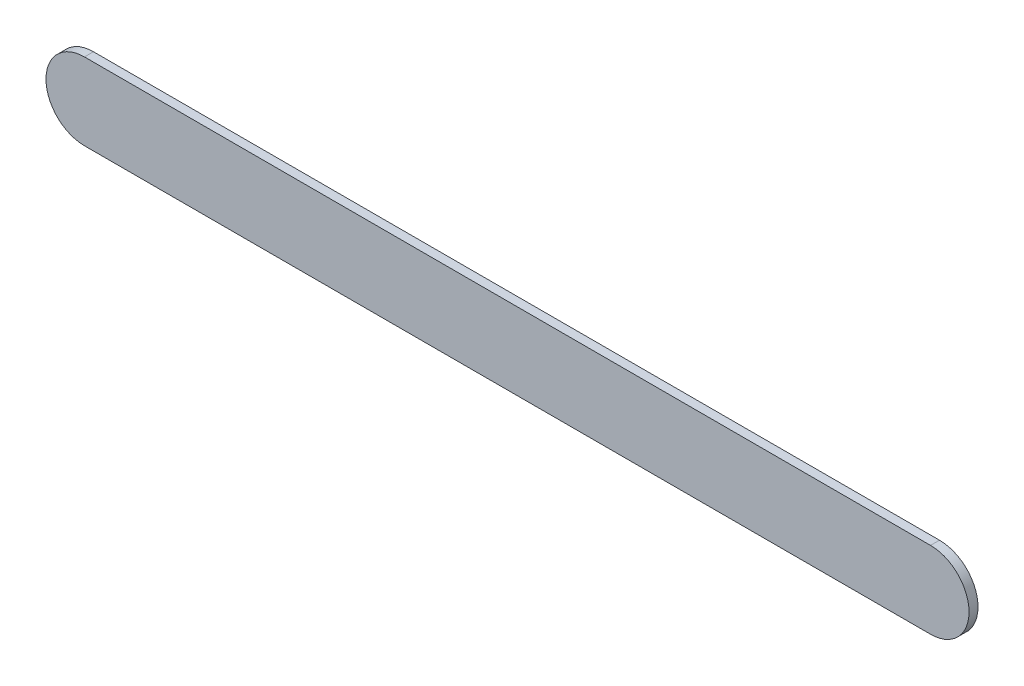
ISO-10303-21;
HEADER;
FILE_DESCRIPTION(('STEP AP214'),'2;1');
FILE_NAME('part.step','',(''),(''),'','','');
FILE_SCHEMA(('AUTOMOTIVE_DESIGN { 1 0 10303 214 1 1 1 1 }'));
ENDSEC;
DATA;
#1=APPLICATION_CONTEXT('core data for automotive mechanical design processes');
#2=APPLICATION_PROTOCOL_DEFINITION('international standard','automotive_design',2000,#1);
#3=PRODUCT_CONTEXT('',#1,'mechanical');
#4=PRODUCT('Part','Part','',(#3));
#5=PRODUCT_RELATED_PRODUCT_CATEGORY('part','',(#4));
#6=PRODUCT_DEFINITION_FORMATION('','',#4);
#7=PRODUCT_DEFINITION_CONTEXT('part definition',#1,'design');
#8=PRODUCT_DEFINITION('design','',#6,#7);
#9=PRODUCT_DEFINITION_SHAPE('','',#8);
#10=(LENGTH_UNIT() NAMED_UNIT(*) SI_UNIT(.MILLI.,.METRE.));
#11=(NAMED_UNIT(*) PLANE_ANGLE_UNIT() SI_UNIT($,.RADIAN.));
#12=(NAMED_UNIT(*) SI_UNIT($,.STERADIAN.) SOLID_ANGLE_UNIT());
#13=UNCERTAINTY_MEASURE_WITH_UNIT(LENGTH_MEASURE(1.E-05),#10,'distance_accuracy_value','');
#14=(GEOMETRIC_REPRESENTATION_CONTEXT(3) GLOBAL_UNCERTAINTY_ASSIGNED_CONTEXT((#13)) GLOBAL_UNIT_ASSIGNED_CONTEXT((#10,
#11,#12)) REPRESENTATION_CONTEXT('',''));
#15=CARTESIAN_POINT('',(0.,0.,0.));
#16=DIRECTION('',(0.,0.,1.));
#17=DIRECTION('',(1.,0.,0.));
#18=AXIS2_PLACEMENT_3D('',#15,#16,#17);
#19=CARTESIAN_POINT('',(131.4125,-68.65,1.635));
#20=DIRECTION('',(0.,0.,1.));
#21=DIRECTION('',(1.,0.,0.));
#22=AXIS2_PLACEMENT_3D('',#19,#20,#21);
#23=PLANE('',#22);
#24=DIRECTION('',(1.,0.,0.));
#25=VECTOR('',#24,1.);
#26=CARTESIAN_POINT('',(131.4125,-68.65,1.635));
#27=LINE('',#26,#25);
#28=CARTESIAN_POINT('',(131.4125,-68.65,1.635));
#29=VERTEX_POINT('',#28);
#30=CARTESIAN_POINT('',(134.71,-68.65,1.635));
#31=VERTEX_POINT('',#30);
#32=EDGE_CURVE('E87',#29,#31,#27,.T.);
#33=ORIENTED_EDGE('',*,*,#32,.T.);
#34=CARTESIAN_POINT('',(134.71,-68.5,1.635));
#35=DIRECTION('',(0.,0.,1.));
#36=DIRECTION('',(-1.894780628694E-13,-1.,0.));
#37=AXIS2_PLACEMENT_3D('',#34,#35,#36);
#38=CIRCLE('',#37,0.15);
#39=CARTESIAN_POINT('',(134.71,-68.35,1.635));
#40=VERTEX_POINT('',#39);
#41=EDGE_CURVE('E112',#31,#40,#38,.T.);
#42=ORIENTED_EDGE('',*,*,#41,.T.);
#43=DIRECTION('',(-1.,0.,0.));
#44=VECTOR('',#43,1.);
#45=CARTESIAN_POINT('',(134.71,-68.35,1.635));
#46=LINE('',#45,#44);
#47=CARTESIAN_POINT('',(131.4125,-68.35,1.635));
#48=VERTEX_POINT('',#47);
#49=EDGE_CURVE('E49',#40,#48,#46,.T.);
#50=ORIENTED_EDGE('',*,*,#49,.T.);
#51=CARTESIAN_POINT('',(131.4125,-68.5,1.635));
#52=DIRECTION('',(0.,0.,1.));
#53=DIRECTION('',(1.894780628694E-13,1.,0.));
#54=AXIS2_PLACEMENT_3D('',#51,#52,#53);
#55=CIRCLE('',#54,0.15);
#56=EDGE_CURVE('E11',#48,#29,#55,.T.);
#57=ORIENTED_EDGE('',*,*,#56,.T.);
#58=EDGE_LOOP('',(#33,#42,#50,#57));
#59=FACE_BOUND('',#58,.T.);
#60=ADVANCED_FACE('F17',(#59),#23,.T.);
#61=CARTESIAN_POINT('',(131.4125,-68.65,1.6));
#62=DIRECTION('',(0.,0.,1.));
#63=DIRECTION('',(1.,0.,0.));
#64=AXIS2_PLACEMENT_3D('',#61,#62,#63);
#65=PLANE('',#64);
#66=CARTESIAN_POINT('',(131.4125,-68.5,1.6));
#67=DIRECTION('',(0.,0.,1.));
#68=DIRECTION('',(1.894780628694E-13,1.,0.));
#69=AXIS2_PLACEMENT_3D('',#66,#67,#68);
#70=CIRCLE('',#69,0.15);
#71=CARTESIAN_POINT('',(131.4125,-68.35,1.6));
#72=VERTEX_POINT('',#71);
#73=CARTESIAN_POINT('',(131.4125,-68.65,1.6));
#74=VERTEX_POINT('',#73);
#75=EDGE_CURVE('E20',#72,#74,#70,.T.);
#76=ORIENTED_EDGE('',*,*,#75,.F.);
#77=DIRECTION('',(-1.,0.,0.));
#78=VECTOR('',#77,1.);
#79=CARTESIAN_POINT('',(134.71,-68.35,1.6));
#80=LINE('',#79,#78);
#81=CARTESIAN_POINT('',(134.71,-68.35,1.6));
#82=VERTEX_POINT('',#81);
#83=EDGE_CURVE('E58',#82,#72,#80,.T.);
#84=ORIENTED_EDGE('',*,*,#83,.F.);
#85=CARTESIAN_POINT('',(134.71,-68.5,1.6));
#86=DIRECTION('',(0.,0.,1.));
#87=DIRECTION('',(-1.894780628694E-13,-1.,0.));
#88=AXIS2_PLACEMENT_3D('',#85,#86,#87);
#89=CIRCLE('',#88,0.15);
#90=CARTESIAN_POINT('',(134.71,-68.65,1.6));
#91=VERTEX_POINT('',#90);
#92=EDGE_CURVE('E89',#91,#82,#89,.T.);
#93=ORIENTED_EDGE('',*,*,#92,.F.);
#94=DIRECTION('',(1.,0.,0.));
#95=VECTOR('',#94,1.);
#96=CARTESIAN_POINT('',(131.4125,-68.65,1.6));
#97=LINE('',#96,#95);
#98=EDGE_CURVE('E86',#74,#91,#97,.T.);
#99=ORIENTED_EDGE('',*,*,#98,.F.);
#100=EDGE_LOOP('',(#76,#84,#93,#99));
#101=FACE_BOUND('',#100,.T.);
#102=ADVANCED_FACE('F91',(#101),#65,.F.);
#103=CARTESIAN_POINT('',(131.4125,-68.5,1.6));
#104=DIRECTION('',(0.,0.,-1.));
#105=DIRECTION('',(1.894780628694E-13,1.,0.));
#106=AXIS2_PLACEMENT_3D('',#103,#104,#105);
#107=CYLINDRICAL_SURFACE('',#106,0.15);
#108=ORIENTED_EDGE('',*,*,#75,.T.);
#109=DIRECTION('',(0.,0.,1.));
#110=VECTOR('',#109,1.);
#111=CARTESIAN_POINT('',(131.4125,-68.65,1.6));
#112=LINE('',#111,#110);
#113=EDGE_CURVE('E77',#74,#29,#112,.T.);
#114=ORIENTED_EDGE('',*,*,#113,.T.);
#115=ORIENTED_EDGE('',*,*,#56,.F.);
#116=DIRECTION('',(0.,0.,1.));
#117=VECTOR('',#116,1.);
#118=CARTESIAN_POINT('',(131.4125,-68.35,1.6));
#119=LINE('',#118,#117);
#120=EDGE_CURVE('E79',#72,#48,#119,.T.);
#121=ORIENTED_EDGE('',*,*,#120,.F.);
#122=EDGE_LOOP('',(#108,#114,#115,#121));
#123=FACE_BOUND('',#122,.T.);
#124=ADVANCED_FACE('F76',(#123),#107,.T.);
#125=CARTESIAN_POINT('',(134.71,-68.35,1.6));
#126=DIRECTION('',(0.,-1.,0.));
#127=DIRECTION('',(0.,0.,-1.));
#128=AXIS2_PLACEMENT_3D('',#125,#126,#127);
#129=PLANE('',#128);
#130=ORIENTED_EDGE('',*,*,#83,.T.);
#131=ORIENTED_EDGE('',*,*,#120,.T.);
#132=ORIENTED_EDGE('',*,*,#49,.F.);
#133=DIRECTION('',(0.,0.,1.));
#134=VECTOR('',#133,1.);
#135=CARTESIAN_POINT('',(134.71,-68.35,1.6));
#136=LINE('',#135,#134);
#137=EDGE_CURVE('E108',#82,#40,#136,.T.);
#138=ORIENTED_EDGE('',*,*,#137,.F.);
#139=EDGE_LOOP('',(#130,#131,#132,#138));
#140=FACE_BOUND('',#139,.T.);
#141=ADVANCED_FACE('F120',(#140),#129,.F.);
#142=CARTESIAN_POINT('',(134.71,-68.5,1.6));
#143=DIRECTION('',(0.,0.,-1.));
#144=DIRECTION('',(-1.894780628694E-13,-1.,0.));
#145=AXIS2_PLACEMENT_3D('',#142,#143,#144);
#146=CYLINDRICAL_SURFACE('',#145,0.15);
#147=ORIENTED_EDGE('',*,*,#92,.T.);
#148=ORIENTED_EDGE('',*,*,#137,.T.);
#149=ORIENTED_EDGE('',*,*,#41,.F.);
#150=DIRECTION('',(0.,0.,1.));
#151=VECTOR('',#150,1.);
#152=CARTESIAN_POINT('',(134.71,-68.65,1.6));
#153=LINE('',#152,#151);
#154=EDGE_CURVE('E95',#91,#31,#153,.T.);
#155=ORIENTED_EDGE('',*,*,#154,.F.);
#156=EDGE_LOOP('',(#147,#148,#149,#155));
#157=FACE_BOUND('',#156,.T.);
#158=ADVANCED_FACE('F122',(#157),#146,.T.);
#159=CARTESIAN_POINT('',(131.4125,-68.65,1.6));
#160=DIRECTION('',(0.,1.,0.));
#161=DIRECTION('',(1.,0.,0.));
#162=AXIS2_PLACEMENT_3D('',#159,#160,#161);
#163=PLANE('',#162);
#164=ORIENTED_EDGE('',*,*,#98,.T.);
#165=ORIENTED_EDGE('',*,*,#154,.T.);
#166=ORIENTED_EDGE('',*,*,#32,.F.);
#167=ORIENTED_EDGE('',*,*,#113,.F.);
#168=EDGE_LOOP('',(#164,#165,#166,#167));
#169=FACE_BOUND('',#168,.T.);
#170=ADVANCED_FACE('F84',(#169),#163,.F.);
#171=CLOSED_SHELL('',(#60,#102,#124,#141,#158,#170));
#172=MANIFOLD_SOLID_BREP('B1',#171);
#173=ADVANCED_BREP_SHAPE_REPRESENTATION('',(#18,#172),#14);
#174=SHAPE_DEFINITION_REPRESENTATION(#9,#173);
ENDSEC;
END-ISO-10303-21;
